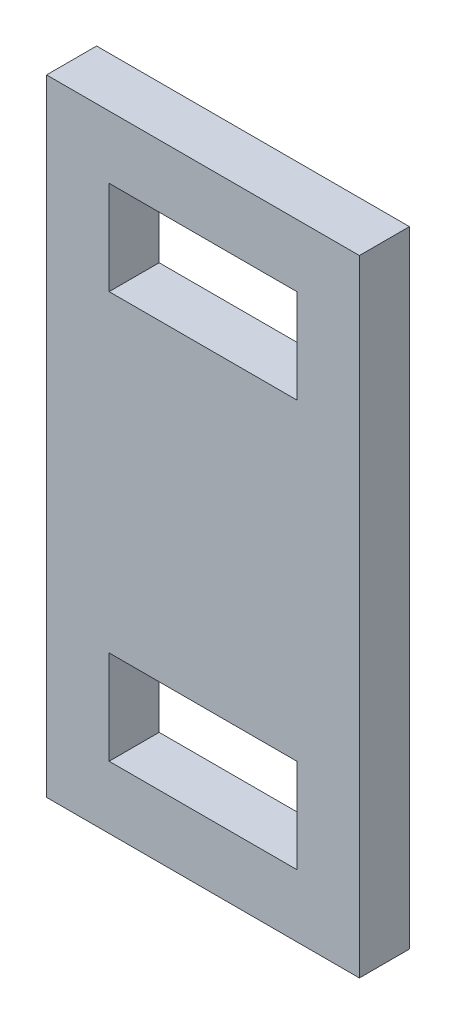
ISO-10303-21;
HEADER;
FILE_DESCRIPTION(('STEP AP214'),'2;1');
FILE_NAME('part.step','',(''),(''),'','','');
FILE_SCHEMA(('AUTOMOTIVE_DESIGN { 1 0 10303 214 1 1 1 1 }'));
ENDSEC;
DATA;
#1=APPLICATION_CONTEXT('core data for automotive mechanical design processes');
#2=APPLICATION_PROTOCOL_DEFINITION('international standard','automotive_design',2000,#1);
#3=PRODUCT_CONTEXT('',#1,'mechanical');
#4=PRODUCT('Part','Part','',(#3));
#5=PRODUCT_RELATED_PRODUCT_CATEGORY('part','',(#4));
#6=PRODUCT_DEFINITION_FORMATION('','',#4);
#7=PRODUCT_DEFINITION_CONTEXT('part definition',#1,'design');
#8=PRODUCT_DEFINITION('design','',#6,#7);
#9=PRODUCT_DEFINITION_SHAPE('','',#8);
#10=(LENGTH_UNIT() NAMED_UNIT(*) SI_UNIT(.MILLI.,.METRE.));
#11=(NAMED_UNIT(*) PLANE_ANGLE_UNIT() SI_UNIT($,.RADIAN.));
#12=(NAMED_UNIT(*) SI_UNIT($,.STERADIAN.) SOLID_ANGLE_UNIT());
#13=UNCERTAINTY_MEASURE_WITH_UNIT(LENGTH_MEASURE(1.E-05),#10,'distance_accuracy_value','');
#14=(GEOMETRIC_REPRESENTATION_CONTEXT(3) GLOBAL_UNCERTAINTY_ASSIGNED_CONTEXT((#13)) GLOBAL_UNIT_ASSIGNED_CONTEXT((#10,
#11,#12)) REPRESENTATION_CONTEXT('',''));
#15=CARTESIAN_POINT('',(0.,0.,0.));
#16=DIRECTION('',(0.,0.,1.));
#17=DIRECTION('',(1.,0.,0.));
#18=AXIS2_PLACEMENT_3D('',#15,#16,#17);
#19=CARTESIAN_POINT('',(0.,0.,0.8));
#20=DIRECTION('',(0.,0.,1.));
#21=DIRECTION('',(1.,0.,0.));
#22=AXIS2_PLACEMENT_3D('',#19,#20,#21);
#23=PLANE('',#22);
#24=DIRECTION('',(0.,-1.,0.));
#25=VECTOR('',#24,1.);
#26=CARTESIAN_POINT('',(0.,0.,0.8));
#27=LINE('',#26,#25);
#28=CARTESIAN_POINT('',(0.,0.,0.8));
#29=VERTEX_POINT('',#28);
#30=CARTESIAN_POINT('',(0.,-10.,0.8));
#31=VERTEX_POINT('',#30);
#32=EDGE_CURVE('E189',#29,#31,#27,.T.);
#33=ORIENTED_EDGE('',*,*,#32,.T.);
#34=DIRECTION('',(1.,0.,0.));
#35=VECTOR('',#34,1.);
#36=CARTESIAN_POINT('',(0.,-10.,0.8));
#37=LINE('',#36,#35);
#38=CARTESIAN_POINT('',(5.,-10.,0.8));
#39=VERTEX_POINT('',#38);
#40=EDGE_CURVE('E192',#31,#39,#37,.T.);
#41=ORIENTED_EDGE('',*,*,#40,.T.);
#42=DIRECTION('',(0.,1.,0.));
#43=VECTOR('',#42,1.);
#44=CARTESIAN_POINT('',(5.,0.,0.8));
#45=LINE('',#44,#43);
#46=CARTESIAN_POINT('',(5.,0.,0.8));
#47=VERTEX_POINT('',#46);
#48=EDGE_CURVE('E195',#39,#47,#45,.T.);
#49=ORIENTED_EDGE('',*,*,#48,.T.);
#50=DIRECTION('',(-1.,0.,0.));
#51=VECTOR('',#50,1.);
#52=CARTESIAN_POINT('',(0.,0.,0.8));
#53=LINE('',#52,#51);
#54=EDGE_CURVE('E197',#47,#29,#53,.T.);
#55=ORIENTED_EDGE('',*,*,#54,.T.);
#56=EDGE_LOOP('',(#33,#41,#49,#55));
#57=FACE_BOUND('',#56,.T.);
#58=DIRECTION('',(1.,0.,0.));
#59=VECTOR('',#58,1.);
#60=CARTESIAN_POINT('',(1.,-9.,0.8));
#61=LINE('',#60,#59);
#62=CARTESIAN_POINT('',(1.,-9.,0.8));
#63=VERTEX_POINT('',#62);
#64=CARTESIAN_POINT('',(4.,-9.,0.8));
#65=VERTEX_POINT('',#64);
#66=EDGE_CURVE('E160',#63,#65,#61,.T.);
#67=ORIENTED_EDGE('',*,*,#66,.F.);
#68=DIRECTION('',(0.,-1.,0.));
#69=VECTOR('',#68,1.);
#70=CARTESIAN_POINT('',(1.,-7.5,0.8));
#71=LINE('',#70,#69);
#72=CARTESIAN_POINT('',(1.,-7.5,0.8));
#73=VERTEX_POINT('',#72);
#74=EDGE_CURVE('E158',#73,#63,#71,.T.);
#75=ORIENTED_EDGE('',*,*,#74,.F.);
#76=DIRECTION('',(-1.,0.,0.));
#77=VECTOR('',#76,1.);
#78=CARTESIAN_POINT('',(1.,-7.5,0.8));
#79=LINE('',#78,#77);
#80=CARTESIAN_POINT('',(4.,-7.5,0.8));
#81=VERTEX_POINT('',#80);
#82=EDGE_CURVE('E166',#81,#73,#79,.T.);
#83=ORIENTED_EDGE('',*,*,#82,.F.);
#84=DIRECTION('',(0.,1.,0.));
#85=VECTOR('',#84,1.);
#86=CARTESIAN_POINT('',(4.,-7.5,0.8));
#87=LINE('',#86,#85);
#88=EDGE_CURVE('E163',#65,#81,#87,.T.);
#89=ORIENTED_EDGE('',*,*,#88,.F.);
#90=EDGE_LOOP('',(#67,#75,#83,#89));
#91=FACE_BOUND('',#90,.T.);
#92=DIRECTION('',(1.,0.,0.));
#93=VECTOR('',#92,1.);
#94=CARTESIAN_POINT('',(1.,-2.5,0.8));
#95=LINE('',#94,#93);
#96=CARTESIAN_POINT('',(1.,-2.5,0.8));
#97=VERTEX_POINT('',#96);
#98=CARTESIAN_POINT('',(4.,-2.5,0.8));
#99=VERTEX_POINT('',#98);
#100=EDGE_CURVE('E130',#97,#99,#95,.T.);
#101=ORIENTED_EDGE('',*,*,#100,.F.);
#102=DIRECTION('',(0.,-1.,0.));
#103=VECTOR('',#102,1.);
#104=CARTESIAN_POINT('',(1.,-2.5,0.8));
#105=LINE('',#104,#103);
#106=CARTESIAN_POINT('',(1.,-0.999999999999999,0.8));
#107=VERTEX_POINT('',#106);
#108=EDGE_CURVE('E122',#107,#97,#105,.T.);
#109=ORIENTED_EDGE('',*,*,#108,.F.);
#110=DIRECTION('',(-1.,0.,0.));
#111=VECTOR('',#110,1.);
#112=CARTESIAN_POINT('',(1.,-0.999999999999999,0.8));
#113=LINE('',#112,#111);
#114=CARTESIAN_POINT('',(4.,-0.999999999999999,0.8));
#115=VERTEX_POINT('',#114);
#116=EDGE_CURVE('E144',#115,#107,#113,.T.);
#117=ORIENTED_EDGE('',*,*,#116,.F.);
#118=DIRECTION('',(0.,1.,0.));
#119=VECTOR('',#118,1.);
#120=CARTESIAN_POINT('',(4.,-2.5,0.8));
#121=LINE('',#120,#119);
#122=EDGE_CURVE('E142',#99,#115,#121,.T.);
#123=ORIENTED_EDGE('',*,*,#122,.F.);
#124=EDGE_LOOP('',(#101,#109,#117,#123));
#125=FACE_BOUND('',#124,.T.);
#126=ADVANCED_FACE('F33',(#57,#91,#125),#23,.T.);
#127=CARTESIAN_POINT('',(0.,0.,0.));
#128=DIRECTION('',(0.,0.,1.));
#129=DIRECTION('',(1.,0.,0.));
#130=AXIS2_PLACEMENT_3D('',#127,#128,#129);
#131=PLANE('',#130);
#132=DIRECTION('',(0.,-1.,0.));
#133=VECTOR('',#132,1.);
#134=CARTESIAN_POINT('',(1.,-7.5,0.));
#135=LINE('',#134,#133);
#136=CARTESIAN_POINT('',(1.,-7.5,0.));
#137=VERTEX_POINT('',#136);
#138=CARTESIAN_POINT('',(1.,-9.,0.));
#139=VERTEX_POINT('',#138);
#140=EDGE_CURVE('E138',#137,#139,#135,.T.);
#141=ORIENTED_EDGE('',*,*,#140,.T.);
#142=DIRECTION('',(1.,0.,0.));
#143=VECTOR('',#142,1.);
#144=CARTESIAN_POINT('',(1.,-9.,0.));
#145=LINE('',#144,#143);
#146=CARTESIAN_POINT('',(4.,-9.,0.));
#147=VERTEX_POINT('',#146);
#148=EDGE_CURVE('E171',#139,#147,#145,.T.);
#149=ORIENTED_EDGE('',*,*,#148,.T.);
#150=DIRECTION('',(0.,1.,0.));
#151=VECTOR('',#150,1.);
#152=CARTESIAN_POINT('',(4.,-7.5,0.));
#153=LINE('',#152,#151);
#154=CARTESIAN_POINT('',(4.,-7.5,0.));
#155=VERTEX_POINT('',#154);
#156=EDGE_CURVE('E174',#147,#155,#153,.T.);
#157=ORIENTED_EDGE('',*,*,#156,.T.);
#158=DIRECTION('',(-1.,0.,0.));
#159=VECTOR('',#158,1.);
#160=CARTESIAN_POINT('',(1.,-7.5,0.));
#161=LINE('',#160,#159);
#162=EDGE_CURVE('E161',#155,#137,#161,.T.);
#163=ORIENTED_EDGE('',*,*,#162,.T.);
#164=EDGE_LOOP('',(#141,#149,#157,#163));
#165=FACE_BOUND('',#164,.T.);
#166=DIRECTION('',(0.,-1.,0.));
#167=VECTOR('',#166,1.);
#168=CARTESIAN_POINT('',(0.,0.,0.));
#169=LINE('',#168,#167);
#170=CARTESIAN_POINT('',(0.,0.,0.));
#171=VERTEX_POINT('',#170);
#172=CARTESIAN_POINT('',(0.,-10.,0.));
#173=VERTEX_POINT('',#172);
#174=EDGE_CURVE('E188',#171,#173,#169,.T.);
#175=ORIENTED_EDGE('',*,*,#174,.F.);
#176=DIRECTION('',(-1.,0.,0.));
#177=VECTOR('',#176,1.);
#178=CARTESIAN_POINT('',(0.,0.,0.));
#179=LINE('',#178,#177);
#180=CARTESIAN_POINT('',(5.,0.,0.));
#181=VERTEX_POINT('',#180);
#182=EDGE_CURVE('E193',#181,#171,#179,.T.);
#183=ORIENTED_EDGE('',*,*,#182,.F.);
#184=DIRECTION('',(0.,1.,0.));
#185=VECTOR('',#184,1.);
#186=CARTESIAN_POINT('',(5.,0.,0.));
#187=LINE('',#186,#185);
#188=CARTESIAN_POINT('',(5.,-10.,0.));
#189=VERTEX_POINT('',#188);
#190=EDGE_CURVE('E204',#189,#181,#187,.T.);
#191=ORIENTED_EDGE('',*,*,#190,.F.);
#192=DIRECTION('',(1.,0.,0.));
#193=VECTOR('',#192,1.);
#194=CARTESIAN_POINT('',(0.,-10.,0.));
#195=LINE('',#194,#193);
#196=EDGE_CURVE('E202',#173,#189,#195,.T.);
#197=ORIENTED_EDGE('',*,*,#196,.F.);
#198=EDGE_LOOP('',(#175,#183,#191,#197));
#199=FACE_BOUND('',#198,.T.);
#200=DIRECTION('',(0.,-1.,0.));
#201=VECTOR('',#200,1.);
#202=CARTESIAN_POINT('',(1.,-2.5,0.));
#203=LINE('',#202,#201);
#204=CARTESIAN_POINT('',(1.,-0.999999999999999,0.));
#205=VERTEX_POINT('',#204);
#206=CARTESIAN_POINT('',(1.,-2.5,0.));
#207=VERTEX_POINT('',#206);
#208=EDGE_CURVE('E56',#205,#207,#203,.T.);
#209=ORIENTED_EDGE('',*,*,#208,.T.);
#210=DIRECTION('',(1.,0.,0.));
#211=VECTOR('',#210,1.);
#212=CARTESIAN_POINT('',(1.,-2.5,0.));
#213=LINE('',#212,#211);
#214=CARTESIAN_POINT('',(4.,-2.5,0.));
#215=VERTEX_POINT('',#214);
#216=EDGE_CURVE('E137',#207,#215,#213,.T.);
#217=ORIENTED_EDGE('',*,*,#216,.T.);
#218=DIRECTION('',(0.,1.,0.));
#219=VECTOR('',#218,1.);
#220=CARTESIAN_POINT('',(4.,-2.5,0.));
#221=LINE('',#220,#219);
#222=CARTESIAN_POINT('',(4.,-0.999999999999999,0.));
#223=VERTEX_POINT('',#222);
#224=EDGE_CURVE('E150',#215,#223,#221,.T.);
#225=ORIENTED_EDGE('',*,*,#224,.T.);
#226=DIRECTION('',(-1.,0.,0.));
#227=VECTOR('',#226,1.);
#228=CARTESIAN_POINT('',(1.,-0.999999999999999,0.));
#229=LINE('',#228,#227);
#230=EDGE_CURVE('E131',#223,#205,#229,.T.);
#231=ORIENTED_EDGE('',*,*,#230,.T.);
#232=EDGE_LOOP('',(#209,#217,#225,#231));
#233=FACE_BOUND('',#232,.T.);
#234=ADVANCED_FACE('F222',(#165,#199,#233),#131,.F.);
#235=CARTESIAN_POINT('',(0.,0.,0.8));
#236=DIRECTION('',(1.,0.,0.));
#237=DIRECTION('',(0.,0.,-1.));
#238=AXIS2_PLACEMENT_3D('',#235,#236,#237);
#239=PLANE('',#238);
#240=ORIENTED_EDGE('',*,*,#174,.T.);
#241=DIRECTION('',(0.,0.,-1.));
#242=VECTOR('',#241,1.);
#243=CARTESIAN_POINT('',(0.,-10.,0.8));
#244=LINE('',#243,#242);
#245=EDGE_CURVE('E11',#31,#173,#244,.T.);
#246=ORIENTED_EDGE('',*,*,#245,.F.);
#247=ORIENTED_EDGE('',*,*,#32,.F.);
#248=DIRECTION('',(0.,0.,-1.));
#249=VECTOR('',#248,1.);
#250=CARTESIAN_POINT('',(0.,0.,0.8));
#251=LINE('',#250,#249);
#252=EDGE_CURVE('E199',#29,#171,#251,.T.);
#253=ORIENTED_EDGE('',*,*,#252,.T.);
#254=EDGE_LOOP('',(#240,#246,#247,#253));
#255=FACE_BOUND('',#254,.T.);
#256=ADVANCED_FACE('F35',(#255),#239,.F.);
#257=CARTESIAN_POINT('',(0.,-10.,0.8));
#258=DIRECTION('',(0.,1.,0.));
#259=DIRECTION('',(0.,0.,1.));
#260=AXIS2_PLACEMENT_3D('',#257,#258,#259);
#261=PLANE('',#260);
#262=ORIENTED_EDGE('',*,*,#196,.T.);
#263=DIRECTION('',(0.,0.,-1.));
#264=VECTOR('',#263,1.);
#265=CARTESIAN_POINT('',(5.,-10.,0.8));
#266=LINE('',#265,#264);
#267=EDGE_CURVE('E41',#39,#189,#266,.T.);
#268=ORIENTED_EDGE('',*,*,#267,.F.);
#269=ORIENTED_EDGE('',*,*,#40,.F.);
#270=ORIENTED_EDGE('',*,*,#245,.T.);
#271=EDGE_LOOP('',(#262,#268,#269,#270));
#272=FACE_BOUND('',#271,.T.);
#273=ADVANCED_FACE('F233',(#272),#261,.F.);
#274=CARTESIAN_POINT('',(5.,0.,0.8));
#275=DIRECTION('',(-1.,0.,0.));
#276=DIRECTION('',(0.,-1.,0.));
#277=AXIS2_PLACEMENT_3D('',#274,#275,#276);
#278=PLANE('',#277);
#279=ORIENTED_EDGE('',*,*,#190,.T.);
#280=DIRECTION('',(0.,0.,-1.));
#281=VECTOR('',#280,1.);
#282=CARTESIAN_POINT('',(5.,0.,0.8));
#283=LINE('',#282,#281);
#284=EDGE_CURVE('E209',#47,#181,#283,.T.);
#285=ORIENTED_EDGE('',*,*,#284,.F.);
#286=ORIENTED_EDGE('',*,*,#48,.F.);
#287=ORIENTED_EDGE('',*,*,#267,.T.);
#288=EDGE_LOOP('',(#279,#285,#286,#287));
#289=FACE_BOUND('',#288,.T.);
#290=ADVANCED_FACE('F216',(#289),#278,.F.);
#291=CARTESIAN_POINT('',(0.,0.,0.8));
#292=DIRECTION('',(0.,-1.,0.));
#293=DIRECTION('',(0.,0.,-1.));
#294=AXIS2_PLACEMENT_3D('',#291,#292,#293);
#295=PLANE('',#294);
#296=ORIENTED_EDGE('',*,*,#182,.T.);
#297=ORIENTED_EDGE('',*,*,#252,.F.);
#298=ORIENTED_EDGE('',*,*,#54,.F.);
#299=ORIENTED_EDGE('',*,*,#284,.T.);
#300=EDGE_LOOP('',(#296,#297,#298,#299));
#301=FACE_BOUND('',#300,.T.);
#302=ADVANCED_FACE('F226',(#301),#295,.F.);
#303=CARTESIAN_POINT('',(1.,-7.5,0.8));
#304=DIRECTION('',(1.,0.,0.));
#305=DIRECTION('',(0.,1.,0.));
#306=AXIS2_PLACEMENT_3D('',#303,#304,#305);
#307=PLANE('',#306);
#308=ORIENTED_EDGE('',*,*,#140,.F.);
#309=DIRECTION('',(0.,0.,-1.));
#310=VECTOR('',#309,1.);
#311=CARTESIAN_POINT('',(1.,-7.5,0.8));
#312=LINE('',#311,#310);
#313=EDGE_CURVE('E168',#73,#137,#312,.T.);
#314=ORIENTED_EDGE('',*,*,#313,.F.);
#315=ORIENTED_EDGE('',*,*,#74,.T.);
#316=DIRECTION('',(0.,0.,-1.));
#317=VECTOR('',#316,1.);
#318=CARTESIAN_POINT('',(1.,-9.,0.8));
#319=LINE('',#318,#317);
#320=EDGE_CURVE('E185',#63,#139,#319,.T.);
#321=ORIENTED_EDGE('',*,*,#320,.T.);
#322=EDGE_LOOP('',(#308,#314,#315,#321));
#323=FACE_BOUND('',#322,.T.);
#324=ADVANCED_FACE('F248',(#323),#307,.T.);
#325=CARTESIAN_POINT('',(1.,-9.,0.8));
#326=DIRECTION('',(0.,1.,0.));
#327=DIRECTION('',(0.,0.,1.));
#328=AXIS2_PLACEMENT_3D('',#325,#326,#327);
#329=PLANE('',#328);
#330=ORIENTED_EDGE('',*,*,#148,.F.);
#331=ORIENTED_EDGE('',*,*,#320,.F.);
#332=ORIENTED_EDGE('',*,*,#66,.T.);
#333=DIRECTION('',(0.,0.,-1.));
#334=VECTOR('',#333,1.);
#335=CARTESIAN_POINT('',(4.,-9.,0.8));
#336=LINE('',#335,#334);
#337=EDGE_CURVE('E183',#65,#147,#336,.T.);
#338=ORIENTED_EDGE('',*,*,#337,.T.);
#339=EDGE_LOOP('',(#330,#331,#332,#338));
#340=FACE_BOUND('',#339,.T.);
#341=ADVANCED_FACE('F255',(#340),#329,.T.);
#342=CARTESIAN_POINT('',(4.,-7.5,0.8));
#343=DIRECTION('',(-1.,0.,0.));
#344=DIRECTION('',(0.,0.,1.));
#345=AXIS2_PLACEMENT_3D('',#342,#343,#344);
#346=PLANE('',#345);
#347=ORIENTED_EDGE('',*,*,#156,.F.);
#348=ORIENTED_EDGE('',*,*,#337,.F.);
#349=ORIENTED_EDGE('',*,*,#88,.T.);
#350=DIRECTION('',(0.,0.,-1.));
#351=VECTOR('',#350,1.);
#352=CARTESIAN_POINT('',(4.,-7.5,0.8));
#353=LINE('',#352,#351);
#354=EDGE_CURVE('E181',#81,#155,#353,.T.);
#355=ORIENTED_EDGE('',*,*,#354,.T.);
#356=EDGE_LOOP('',(#347,#348,#349,#355));
#357=FACE_BOUND('',#356,.T.);
#358=ADVANCED_FACE('F260',(#357),#346,.T.);
#359=CARTESIAN_POINT('',(1.,-7.5,0.8));
#360=DIRECTION('',(0.,-1.,0.));
#361=DIRECTION('',(0.,0.,-1.));
#362=AXIS2_PLACEMENT_3D('',#359,#360,#361);
#363=PLANE('',#362);
#364=ORIENTED_EDGE('',*,*,#162,.F.);
#365=ORIENTED_EDGE('',*,*,#354,.F.);
#366=ORIENTED_EDGE('',*,*,#82,.T.);
#367=ORIENTED_EDGE('',*,*,#313,.T.);
#368=EDGE_LOOP('',(#364,#365,#366,#367));
#369=FACE_BOUND('',#368,.T.);
#370=ADVANCED_FACE('F267',(#369),#363,.T.);
#371=CARTESIAN_POINT('',(1.,-2.5,0.8));
#372=DIRECTION('',(1.,0.,0.));
#373=DIRECTION('',(0.,1.,0.));
#374=AXIS2_PLACEMENT_3D('',#371,#372,#373);
#375=PLANE('',#374);
#376=ORIENTED_EDGE('',*,*,#208,.F.);
#377=DIRECTION('',(0.,0.,-1.));
#378=VECTOR('',#377,1.);
#379=CARTESIAN_POINT('',(1.,-0.999999999999999,0.8));
#380=LINE('',#379,#378);
#381=EDGE_CURVE('E126',#107,#205,#380,.T.);
#382=ORIENTED_EDGE('',*,*,#381,.F.);
#383=ORIENTED_EDGE('',*,*,#108,.T.);
#384=DIRECTION('',(0.,0.,-1.));
#385=VECTOR('',#384,1.);
#386=CARTESIAN_POINT('',(1.,-2.5,0.8));
#387=LINE('',#386,#385);
#388=EDGE_CURVE('E125',#97,#207,#387,.T.);
#389=ORIENTED_EDGE('',*,*,#388,.T.);
#390=EDGE_LOOP('',(#376,#382,#383,#389));
#391=FACE_BOUND('',#390,.T.);
#392=ADVANCED_FACE('F124',(#391),#375,.T.);
#393=CARTESIAN_POINT('',(1.,-2.5,0.8));
#394=DIRECTION('',(0.,1.,0.));
#395=DIRECTION('',(0.,0.,1.));
#396=AXIS2_PLACEMENT_3D('',#393,#394,#395);
#397=PLANE('',#396);
#398=ORIENTED_EDGE('',*,*,#216,.F.);
#399=ORIENTED_EDGE('',*,*,#388,.F.);
#400=ORIENTED_EDGE('',*,*,#100,.T.);
#401=DIRECTION('',(0.,0.,-1.));
#402=VECTOR('',#401,1.);
#403=CARTESIAN_POINT('',(4.,-2.5,0.8));
#404=LINE('',#403,#402);
#405=EDGE_CURVE('E139',#99,#215,#404,.T.);
#406=ORIENTED_EDGE('',*,*,#405,.T.);
#407=EDGE_LOOP('',(#398,#399,#400,#406));
#408=FACE_BOUND('',#407,.T.);
#409=ADVANCED_FACE('F134',(#408),#397,.T.);
#410=CARTESIAN_POINT('',(4.,-2.5,0.8));
#411=DIRECTION('',(-1.,0.,0.));
#412=DIRECTION('',(0.,0.,1.));
#413=AXIS2_PLACEMENT_3D('',#410,#411,#412);
#414=PLANE('',#413);
#415=ORIENTED_EDGE('',*,*,#224,.F.);
#416=ORIENTED_EDGE('',*,*,#405,.F.);
#417=ORIENTED_EDGE('',*,*,#122,.T.);
#418=DIRECTION('',(0.,0.,-1.));
#419=VECTOR('',#418,1.);
#420=CARTESIAN_POINT('',(4.,-0.999999999999999,0.8));
#421=LINE('',#420,#419);
#422=EDGE_CURVE('E48',#115,#223,#421,.T.);
#423=ORIENTED_EDGE('',*,*,#422,.T.);
#424=EDGE_LOOP('',(#415,#416,#417,#423));
#425=FACE_BOUND('',#424,.T.);
#426=ADVANCED_FACE('F285',(#425),#414,.T.);
#427=CARTESIAN_POINT('',(1.,-0.999999999999999,0.8));
#428=DIRECTION('',(0.,-1.,0.));
#429=DIRECTION('',(0.,0.,-1.));
#430=AXIS2_PLACEMENT_3D('',#427,#428,#429);
#431=PLANE('',#430);
#432=ORIENTED_EDGE('',*,*,#230,.F.);
#433=ORIENTED_EDGE('',*,*,#422,.F.);
#434=ORIENTED_EDGE('',*,*,#116,.T.);
#435=ORIENTED_EDGE('',*,*,#381,.T.);
#436=EDGE_LOOP('',(#432,#433,#434,#435));
#437=FACE_BOUND('',#436,.T.);
#438=ADVANCED_FACE('F288',(#437),#431,.T.);
#439=CLOSED_SHELL('',(#126,#234,#256,#273,#290,#302,#324,#341,#358,#370,#392,#409,#426,#438));
#440=MANIFOLD_SOLID_BREP('B2',#439);
#441=ADVANCED_BREP_SHAPE_REPRESENTATION('',(#18,#440),#14);
#442=SHAPE_DEFINITION_REPRESENTATION(#9,#441);
ENDSEC;
END-ISO-10303-21;
